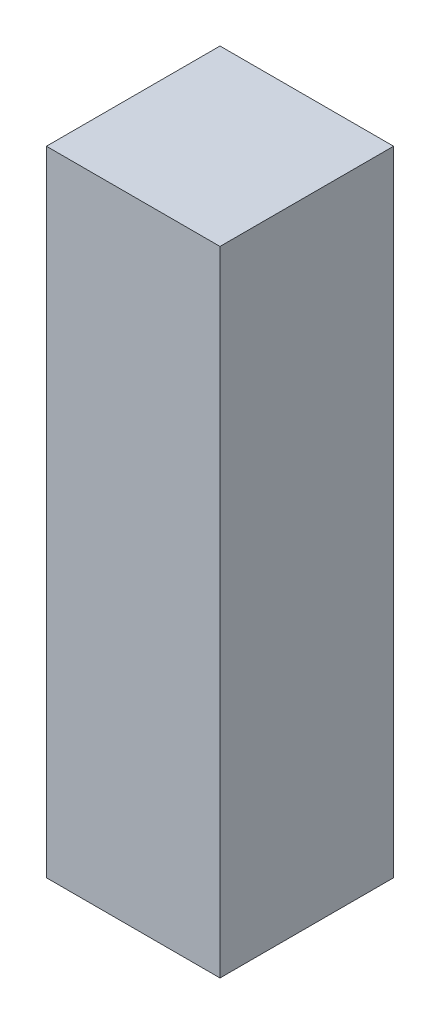
ISO-10303-21;
HEADER;
FILE_DESCRIPTION(('STEP AP214'),'2;1');
FILE_NAME('part.step','',(''),(''),'','','');
FILE_SCHEMA(('AUTOMOTIVE_DESIGN { 1 0 10303 214 1 1 1 1 }'));
ENDSEC;
DATA;
#1=APPLICATION_CONTEXT('core data for automotive mechanical design processes');
#2=APPLICATION_PROTOCOL_DEFINITION('international standard','automotive_design',2000,#1);
#3=PRODUCT_CONTEXT('',#1,'mechanical');
#4=PRODUCT('Part','Part','',(#3));
#5=PRODUCT_RELATED_PRODUCT_CATEGORY('part','',(#4));
#6=PRODUCT_DEFINITION_FORMATION('','',#4);
#7=PRODUCT_DEFINITION_CONTEXT('part definition',#1,'design');
#8=PRODUCT_DEFINITION('design','',#6,#7);
#9=PRODUCT_DEFINITION_SHAPE('','',#8);
#10=(LENGTH_UNIT() NAMED_UNIT(*) SI_UNIT(.MILLI.,.METRE.));
#11=(NAMED_UNIT(*) PLANE_ANGLE_UNIT() SI_UNIT($,.RADIAN.));
#12=(NAMED_UNIT(*) SI_UNIT($,.STERADIAN.) SOLID_ANGLE_UNIT());
#13=UNCERTAINTY_MEASURE_WITH_UNIT(LENGTH_MEASURE(1.E-05),#10,'distance_accuracy_value','');
#14=(GEOMETRIC_REPRESENTATION_CONTEXT(3) GLOBAL_UNCERTAINTY_ASSIGNED_CONTEXT((#13)) GLOBAL_UNIT_ASSIGNED_CONTEXT((#10,
#11,#12)) REPRESENTATION_CONTEXT('',''));
#15=CARTESIAN_POINT('',(0.,0.,0.));
#16=DIRECTION('',(0.,0.,1.));
#17=DIRECTION('',(1.,0.,0.));
#18=AXIS2_PLACEMENT_3D('',#15,#16,#17);
#19=CARTESIAN_POINT('',(10.,73.,-10.));
#20=DIRECTION('',(-1.,0.,0.));
#21=DIRECTION('',(0.,0.,1.));
#22=AXIS2_PLACEMENT_3D('',#19,#20,#21);
#23=PLANE('',#22);
#24=DIRECTION('',(0.,0.,-1.));
#25=VECTOR('',#24,1.);
#26=CARTESIAN_POINT('',(10.,0.,-10.));
#27=LINE('',#26,#25);
#28=CARTESIAN_POINT('',(10.,0.,10.));
#29=VERTEX_POINT('',#28);
#30=CARTESIAN_POINT('',(10.,0.,-10.));
#31=VERTEX_POINT('',#30);
#32=EDGE_CURVE('E103',#29,#31,#27,.T.);
#33=ORIENTED_EDGE('',*,*,#32,.T.);
#34=DIRECTION('',(0.,-1.,0.));
#35=VECTOR('',#34,1.);
#36=CARTESIAN_POINT('',(10.,73.,-10.));
#37=LINE('',#36,#35);
#38=CARTESIAN_POINT('',(10.,73.,-10.));
#39=VERTEX_POINT('',#38);
#40=EDGE_CURVE('E11',#39,#31,#37,.T.);
#41=ORIENTED_EDGE('',*,*,#40,.F.);
#42=DIRECTION('',(0.,0.,-1.));
#43=VECTOR('',#42,1.);
#44=CARTESIAN_POINT('',(10.,73.,-10.));
#45=LINE('',#44,#43);
#46=CARTESIAN_POINT('',(10.,73.,10.));
#47=VERTEX_POINT('',#46);
#48=EDGE_CURVE('E91',#47,#39,#45,.T.);
#49=ORIENTED_EDGE('',*,*,#48,.F.);
#50=DIRECTION('',(0.,-1.,0.));
#51=VECTOR('',#50,1.);
#52=CARTESIAN_POINT('',(10.,73.,10.));
#53=LINE('',#52,#51);
#54=EDGE_CURVE('E99',#47,#29,#53,.T.);
#55=ORIENTED_EDGE('',*,*,#54,.T.);
#56=EDGE_LOOP('',(#33,#41,#49,#55));
#57=FACE_BOUND('',#56,.T.);
#58=ADVANCED_FACE('F40',(#57),#23,.F.);
#59=CARTESIAN_POINT('',(-10.,73.,-10.));
#60=DIRECTION('',(0.,0.,1.));
#61=DIRECTION('',(1.,0.,0.));
#62=AXIS2_PLACEMENT_3D('',#59,#60,#61);
#63=PLANE('',#62);
#64=DIRECTION('',(-1.,0.,0.));
#65=VECTOR('',#64,1.);
#66=CARTESIAN_POINT('',(-10.,0.,-10.));
#67=LINE('',#66,#65);
#68=CARTESIAN_POINT('',(-10.,0.,-10.));
#69=VERTEX_POINT('',#68);
#70=EDGE_CURVE('E95',#31,#69,#67,.T.);
#71=ORIENTED_EDGE('',*,*,#70,.T.);
#72=DIRECTION('',(0.,-1.,0.));
#73=VECTOR('',#72,1.);
#74=CARTESIAN_POINT('',(-10.,73.,-10.));
#75=LINE('',#74,#73);
#76=CARTESIAN_POINT('',(-10.,73.,-10.));
#77=VERTEX_POINT('',#76);
#78=EDGE_CURVE('E48',#77,#69,#75,.T.);
#79=ORIENTED_EDGE('',*,*,#78,.F.);
#80=DIRECTION('',(-1.,0.,0.));
#81=VECTOR('',#80,1.);
#82=CARTESIAN_POINT('',(-10.,73.,-10.));
#83=LINE('',#82,#81);
#84=EDGE_CURVE('E86',#39,#77,#83,.T.);
#85=ORIENTED_EDGE('',*,*,#84,.F.);
#86=ORIENTED_EDGE('',*,*,#40,.T.);
#87=EDGE_LOOP('',(#71,#79,#85,#86));
#88=FACE_BOUND('',#87,.T.);
#89=ADVANCED_FACE('F94',(#88),#63,.F.);
#90=CARTESIAN_POINT('',(-10.,73.,-10.));
#91=DIRECTION('',(1.,0.,0.));
#92=DIRECTION('',(0.,0.,-1.));
#93=AXIS2_PLACEMENT_3D('',#90,#91,#92);
#94=PLANE('',#93);
#95=DIRECTION('',(0.,0.,1.));
#96=VECTOR('',#95,1.);
#97=CARTESIAN_POINT('',(-10.,0.,-10.));
#98=LINE('',#97,#96);
#99=CARTESIAN_POINT('',(-10.,0.,10.));
#100=VERTEX_POINT('',#99);
#101=EDGE_CURVE('E73',#69,#100,#98,.T.);
#102=ORIENTED_EDGE('',*,*,#101,.T.);
#103=DIRECTION('',(0.,-1.,0.));
#104=VECTOR('',#103,1.);
#105=CARTESIAN_POINT('',(-10.,73.,10.));
#106=LINE('',#105,#104);
#107=CARTESIAN_POINT('',(-10.,73.,10.));
#108=VERTEX_POINT('',#107);
#109=EDGE_CURVE('E96',#108,#100,#106,.T.);
#110=ORIENTED_EDGE('',*,*,#109,.F.);
#111=DIRECTION('',(0.,0.,1.));
#112=VECTOR('',#111,1.);
#113=CARTESIAN_POINT('',(-10.,73.,-10.));
#114=LINE('',#113,#112);
#115=EDGE_CURVE('E89',#77,#108,#114,.T.);
#116=ORIENTED_EDGE('',*,*,#115,.F.);
#117=ORIENTED_EDGE('',*,*,#78,.T.);
#118=EDGE_LOOP('',(#102,#110,#116,#117));
#119=FACE_BOUND('',#118,.T.);
#120=ADVANCED_FACE('F97',(#119),#94,.F.);
#121=CARTESIAN_POINT('',(-10.,73.,10.));
#122=DIRECTION('',(0.,0.,-1.));
#123=DIRECTION('',(-1.,0.,0.));
#124=AXIS2_PLACEMENT_3D('',#121,#122,#123);
#125=PLANE('',#124);
#126=DIRECTION('',(1.,0.,0.));
#127=VECTOR('',#126,1.);
#128=CARTESIAN_POINT('',(-10.,0.,10.));
#129=LINE('',#128,#127);
#130=EDGE_CURVE('E79',#100,#29,#129,.T.);
#131=ORIENTED_EDGE('',*,*,#130,.T.);
#132=ORIENTED_EDGE('',*,*,#54,.F.);
#133=DIRECTION('',(1.,0.,0.));
#134=VECTOR('',#133,1.);
#135=CARTESIAN_POINT('',(-10.,73.,10.));
#136=LINE('',#135,#134);
#137=EDGE_CURVE('E56',#108,#47,#136,.T.);
#138=ORIENTED_EDGE('',*,*,#137,.F.);
#139=ORIENTED_EDGE('',*,*,#109,.T.);
#140=EDGE_LOOP('',(#131,#132,#138,#139));
#141=FACE_BOUND('',#140,.T.);
#142=ADVANCED_FACE('F110',(#141),#125,.F.);
#143=CARTESIAN_POINT('',(0.,73.,0.));
#144=DIRECTION('',(0.,1.,0.));
#145=DIRECTION('',(0.,0.,1.));
#146=AXIS2_PLACEMENT_3D('',#143,#144,#145);
#147=PLANE('',#146);
#148=ORIENTED_EDGE('',*,*,#48,.T.);
#149=ORIENTED_EDGE('',*,*,#84,.T.);
#150=ORIENTED_EDGE('',*,*,#115,.T.);
#151=ORIENTED_EDGE('',*,*,#137,.T.);
#152=EDGE_LOOP('',(#148,#149,#150,#151));
#153=FACE_BOUND('',#152,.T.);
#154=ADVANCED_FACE('F87',(#153),#147,.T.);
#155=CARTESIAN_POINT('',(0.,0.,0.));
#156=DIRECTION('',(0.,1.,0.));
#157=DIRECTION('',(0.,0.,1.));
#158=AXIS2_PLACEMENT_3D('',#155,#156,#157);
#159=PLANE('',#158);
#160=ORIENTED_EDGE('',*,*,#32,.F.);
#161=ORIENTED_EDGE('',*,*,#130,.F.);
#162=ORIENTED_EDGE('',*,*,#101,.F.);
#163=ORIENTED_EDGE('',*,*,#70,.F.);
#164=EDGE_LOOP('',(#160,#161,#162,#163));
#165=FACE_BOUND('',#164,.T.);
#166=ADVANCED_FACE('F113',(#165),#159,.F.);
#167=CLOSED_SHELL('',(#58,#89,#120,#142,#154,#166));
#168=MANIFOLD_SOLID_BREP('B2',#167);
#169=ADVANCED_BREP_SHAPE_REPRESENTATION('',(#18,#168),#14);
#170=SHAPE_DEFINITION_REPRESENTATION(#9,#169);
ENDSEC;
END-ISO-10303-21;
